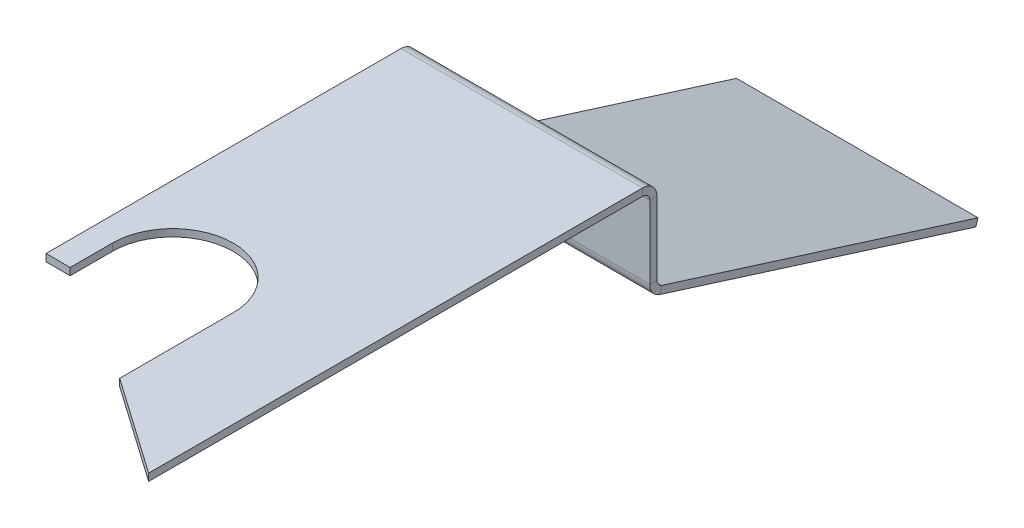
ISO-10303-21;
HEADER;
FILE_DESCRIPTION(('STEP AP214'),'2;1');
FILE_NAME('part.step','',(''),(''),'','','');
FILE_SCHEMA(('AUTOMOTIVE_DESIGN { 1 0 10303 214 1 1 1 1 }'));
ENDSEC;
DATA;
#1=APPLICATION_CONTEXT('core data for automotive mechanical design processes');
#2=APPLICATION_PROTOCOL_DEFINITION('international standard','automotive_design',2000,#1);
#3=PRODUCT_CONTEXT('',#1,'mechanical');
#4=PRODUCT('Part','Part','',(#3));
#5=PRODUCT_RELATED_PRODUCT_CATEGORY('part','',(#4));
#6=PRODUCT_DEFINITION_FORMATION('','',#4);
#7=PRODUCT_DEFINITION_CONTEXT('part definition',#1,'design');
#8=PRODUCT_DEFINITION('design','',#6,#7);
#9=PRODUCT_DEFINITION_SHAPE('','',#8);
#10=(LENGTH_UNIT() NAMED_UNIT(*) SI_UNIT(.MILLI.,.METRE.));
#11=(NAMED_UNIT(*) PLANE_ANGLE_UNIT() SI_UNIT($,.RADIAN.));
#12=(NAMED_UNIT(*) SI_UNIT($,.STERADIAN.) SOLID_ANGLE_UNIT());
#13=UNCERTAINTY_MEASURE_WITH_UNIT(LENGTH_MEASURE(1.E-05),#10,'distance_accuracy_value','');
#14=(GEOMETRIC_REPRESENTATION_CONTEXT(3) GLOBAL_UNCERTAINTY_ASSIGNED_CONTEXT((#13)) GLOBAL_UNIT_ASSIGNED_CONTEXT((#10,
#11,#12)) REPRESENTATION_CONTEXT('',''));
#15=CARTESIAN_POINT('',(0.,0.,0.));
#16=DIRECTION('',(0.,0.,1.));
#17=DIRECTION('',(1.,0.,0.));
#18=AXIS2_PLACEMENT_3D('',#15,#16,#17);
#19=CARTESIAN_POINT('',(100.,6.00000000000003,0.));
#20=DIRECTION('',(0.,1.,0.));
#21=DIRECTION('',(0.,0.,1.));
#22=AXIS2_PLACEMENT_3D('',#19,#20,#21);
#23=PLANE('',#22);
#24=DIRECTION('',(0.,0.,-1.));
#25=VECTOR('',#24,1.);
#26=CARTESIAN_POINT('',(-100.,6.00000000000001,0.));
#27=LINE('',#26,#25);
#28=CARTESIAN_POINT('',(-100.,6.00000000000001,300.));
#29=VERTEX_POINT('',#28);
#30=CARTESIAN_POINT('',(-100.,6.00000000000001,6.00000000000001));
#31=VERTEX_POINT('',#30);
#32=EDGE_CURVE('E191',#29,#31,#27,.T.);
#33=ORIENTED_EDGE('',*,*,#32,.F.);
#34=DIRECTION('',(1.,0.,0.));
#35=VECTOR('',#34,1.);
#36=CARTESIAN_POINT('',(100.,6.00000000000003,300.));
#37=LINE('',#36,#35);
#38=CARTESIAN_POINT('',(-80.,6.00000000000001,300.));
#39=VERTEX_POINT('',#38);
#40=EDGE_CURVE('E53',#39,#29,#37,.F.);
#41=ORIENTED_EDGE('',*,*,#40,.F.);
#42=DIRECTION('',(0.,0.,1.));
#43=VECTOR('',#42,1.);
#44=CARTESIAN_POINT('',(-80.,6.00000000000001,0.));
#45=LINE('',#44,#43);
#46=CARTESIAN_POINT('',(-80.,6.00000000000001,265.));
#47=VERTEX_POINT('',#46);
#48=EDGE_CURVE('E324',#47,#39,#45,.T.);
#49=ORIENTED_EDGE('',*,*,#48,.F.);
#50=CARTESIAN_POINT('',(-30.,6.00000000000001,265.));
#51=DIRECTION('',(0.,1.,0.));
#52=DIRECTION('',(0.,0.,1.));
#53=AXIS2_PLACEMENT_3D('',#50,#51,#52);
#54=CIRCLE('',#53,50.);
#55=CARTESIAN_POINT('',(20.,6.00000000000001,265.));
#56=VERTEX_POINT('',#55);
#57=EDGE_CURVE('E322',#56,#47,#54,.T.);
#58=ORIENTED_EDGE('',*,*,#57,.F.);
#59=DIRECTION('',(0.,0.,1.));
#60=VECTOR('',#59,1.);
#61=CARTESIAN_POINT('',(20.,6.00000000000001,0.));
#62=LINE('',#61,#60);
#63=CARTESIAN_POINT('',(20.,6.00000000000001,358.983396943223));
#64=VERTEX_POINT('',#63);
#65=EDGE_CURVE('E317',#64,#56,#62,.F.);
#66=ORIENTED_EDGE('',*,*,#65,.F.);
#67=DIRECTION('',(-0.819152044288993,0.,-0.573576436351044));
#68=VECTOR('',#67,1.);
#69=CARTESIAN_POINT('',(-94.9862188130756,6.00000000000001,278.469179740077));
#70=LINE('',#69,#68);
#71=CARTESIAN_POINT('',(100.,6.00000000000003,415.));
#72=VERTEX_POINT('',#71);
#73=EDGE_CURVE('E311',#72,#64,#70,.T.);
#74=ORIENTED_EDGE('',*,*,#73,.F.);
#75=DIRECTION('',(0.,0.,-1.));
#76=VECTOR('',#75,1.);
#77=CARTESIAN_POINT('',(100.,6.00000000000003,0.));
#78=LINE('',#77,#76);
#79=CARTESIAN_POINT('',(100.,6.00000000000003,6.00000000000001));
#80=VERTEX_POINT('',#79);
#81=EDGE_CURVE('E251',#72,#80,#78,.T.);
#82=ORIENTED_EDGE('',*,*,#81,.T.);
#83=DIRECTION('',(-1.,0.,0.));
#84=VECTOR('',#83,1.);
#85=CARTESIAN_POINT('',(100.,6.00000000000003,6.00000000000001));
#86=LINE('',#85,#84);
#87=EDGE_CURVE('E204',#80,#31,#86,.T.);
#88=ORIENTED_EDGE('',*,*,#87,.T.);
#89=EDGE_LOOP('',(#33,#41,#49,#58,#66,#74,#82,#88));
#90=FACE_BOUND('',#89,.T.);
#91=ADVANCED_FACE('F38',(#90),#23,.T.);
#92=CARTESIAN_POINT('',(100.,0.,0.));
#93=DIRECTION('',(0.,1.,0.));
#94=DIRECTION('',(0.,0.,1.));
#95=AXIS2_PLACEMENT_3D('',#92,#93,#94);
#96=PLANE('',#95);
#97=DIRECTION('',(-1.,0.,0.));
#98=VECTOR('',#97,1.);
#99=CARTESIAN_POINT('',(100.,0.,300.));
#100=LINE('',#99,#98);
#101=CARTESIAN_POINT('',(-80.,0.,300.));
#102=VERTEX_POINT('',#101);
#103=CARTESIAN_POINT('',(-100.,0.,300.));
#104=VERTEX_POINT('',#103);
#105=EDGE_CURVE('E273',#102,#104,#100,.T.);
#106=ORIENTED_EDGE('',*,*,#105,.T.);
#107=DIRECTION('',(0.,0.,-1.));
#108=VECTOR('',#107,1.);
#109=CARTESIAN_POINT('',(-100.,0.,0.));
#110=LINE('',#109,#108);
#111=CARTESIAN_POINT('',(-100.,0.,6.00000000000001));
#112=VERTEX_POINT('',#111);
#113=EDGE_CURVE('E193',#104,#112,#110,.T.);
#114=ORIENTED_EDGE('',*,*,#113,.T.);
#115=DIRECTION('',(-1.,0.,0.));
#116=VECTOR('',#115,1.);
#117=CARTESIAN_POINT('',(100.,0.,6.00000000000001));
#118=LINE('',#117,#116);
#119=CARTESIAN_POINT('',(100.,0.,6.00000000000001));
#120=VERTEX_POINT('',#119);
#121=EDGE_CURVE('E161',#120,#112,#118,.T.);
#122=ORIENTED_EDGE('',*,*,#121,.F.);
#123=DIRECTION('',(0.,0.,-1.));
#124=VECTOR('',#123,1.);
#125=CARTESIAN_POINT('',(100.,0.,0.));
#126=LINE('',#125,#124);
#127=CARTESIAN_POINT('',(100.,0.,415.));
#128=VERTEX_POINT('',#127);
#129=EDGE_CURVE('E150',#128,#120,#126,.T.);
#130=ORIENTED_EDGE('',*,*,#129,.F.);
#131=DIRECTION('',(-0.819152044288993,0.,-0.573576436351044));
#132=VECTOR('',#131,1.);
#133=CARTESIAN_POINT('',(-94.9862188130756,0.,278.469179740077));
#134=LINE('',#133,#132);
#135=CARTESIAN_POINT('',(20.,0.,358.983396943223));
#136=VERTEX_POINT('',#135);
#137=EDGE_CURVE('E329',#128,#136,#134,.T.);
#138=ORIENTED_EDGE('',*,*,#137,.T.);
#139=DIRECTION('',(0.,0.,-1.));
#140=VECTOR('',#139,1.);
#141=CARTESIAN_POINT('',(20.,0.,0.));
#142=LINE('',#141,#140);
#143=CARTESIAN_POINT('',(20.,0.,265.));
#144=VERTEX_POINT('',#143);
#145=EDGE_CURVE('E297',#136,#144,#142,.T.);
#146=ORIENTED_EDGE('',*,*,#145,.T.);
#147=CARTESIAN_POINT('',(-30.,0.,265.));
#148=DIRECTION('',(0.,1.,0.));
#149=DIRECTION('',(0.,0.,1.));
#150=AXIS2_PLACEMENT_3D('',#147,#148,#149);
#151=CIRCLE('',#150,50.);
#152=CARTESIAN_POINT('',(-80.,0.,265.));
#153=VERTEX_POINT('',#152);
#154=EDGE_CURVE('E290',#144,#153,#151,.T.);
#155=ORIENTED_EDGE('',*,*,#154,.T.);
#156=DIRECTION('',(0.,0.,1.));
#157=VECTOR('',#156,1.);
#158=CARTESIAN_POINT('',(-80.0000000000001,0.,0.));
#159=LINE('',#158,#157);
#160=EDGE_CURVE('E332',#153,#102,#159,.T.);
#161=ORIENTED_EDGE('',*,*,#160,.T.);
#162=EDGE_LOOP('',(#106,#114,#122,#130,#138,#146,#155,#161));
#163=FACE_BOUND('',#162,.T.);
#164=ADVANCED_FACE('F269',(#163),#96,.F.);
#165=CARTESIAN_POINT('',(-100.,-66.1971734624727,-12.));
#166=DIRECTION('',(1.,0.,0.));
#167=DIRECTION('',(0.,0.,-1.));
#168=AXIS2_PLACEMENT_3D('',#165,#166,#167);
#169=PLANE('',#168);
#170=DIRECTION('',(0.,-1.,0.));
#171=VECTOR('',#170,1.);
#172=CARTESIAN_POINT('',(-100.,0.,300.));
#173=LINE('',#172,#171);
#174=EDGE_CURVE('E177',#104,#29,#173,.F.);
#175=ORIENTED_EDGE('',*,*,#174,.T.);
#176=ORIENTED_EDGE('',*,*,#32,.T.);
#177=DIRECTION('',(0.,-1.,0.));
#178=VECTOR('',#177,1.);
#179=CARTESIAN_POINT('',(-100.,6.00000000000001,6.00000000000001));
#180=LINE('',#179,#178);
#181=EDGE_CURVE('E226',#31,#112,#180,.T.);
#182=ORIENTED_EDGE('',*,*,#181,.T.);
#183=ORIENTED_EDGE('',*,*,#113,.F.);
#184=EDGE_LOOP('',(#175,#176,#182,#183));
#185=FACE_BOUND('',#184,.T.);
#186=ADVANCED_FACE('F274',(#185),#169,.F.);
#187=CARTESIAN_POINT('',(100.,0.,6.00000000000001));
#188=DIRECTION('',(1.,0.,0.));
#189=DIRECTION('',(0.,0.,-1.));
#190=AXIS2_PLACEMENT_3D('',#187,#188,#189);
#191=PLANE('',#190);
#192=DIRECTION('',(0.,1.,0.));
#193=VECTOR('',#192,1.);
#194=CARTESIAN_POINT('',(100.,0.,6.00000000000001));
#195=LINE('',#194,#193);
#196=EDGE_CURVE('E11',#120,#80,#195,.T.);
#197=ORIENTED_EDGE('',*,*,#196,.F.);
#198=CARTESIAN_POINT('',(100.,-5.99999999999998,6.00000000000001));
#199=DIRECTION('',(1.,0.,0.));
#200=DIRECTION('',(0.,0.,-1.));
#201=AXIS2_PLACEMENT_3D('',#198,#199,#200);
#202=CIRCLE('',#201,6.);
#203=CARTESIAN_POINT('',(100.,-5.99999999999998,0.));
#204=VERTEX_POINT('',#203);
#205=EDGE_CURVE('E145',#120,#204,#202,.F.);
#206=ORIENTED_EDGE('',*,*,#205,.T.);
#207=DIRECTION('',(0.,0.,1.));
#208=VECTOR('',#207,1.);
#209=CARTESIAN_POINT('',(100.,-5.99999999999998,-6.00000000000001));
#210=LINE('',#209,#208);
#211=CARTESIAN_POINT('',(100.,-5.99999999999998,-6.00000000000001));
#212=VERTEX_POINT('',#211);
#213=EDGE_CURVE('E46',#212,#204,#210,.T.);
#214=ORIENTED_EDGE('',*,*,#213,.F.);
#215=CARTESIAN_POINT('',(100.,-5.99999999999998,6.00000000000001));
#216=DIRECTION('',(1.,0.,0.));
#217=DIRECTION('',(0.,0.,-1.));
#218=AXIS2_PLACEMENT_3D('',#215,#216,#217);
#219=CIRCLE('',#218,12.);
#220=EDGE_CURVE('E237',#80,#212,#219,.F.);
#221=ORIENTED_EDGE('',*,*,#220,.F.);
#222=EDGE_LOOP('',(#197,#206,#214,#221));
#223=FACE_BOUND('',#222,.T.);
#224=ADVANCED_FACE('F40',(#223),#191,.T.);
#225=CARTESIAN_POINT('',(100.,-5.99999999999998,-6.00000000000001));
#226=DIRECTION('',(1.,0.,0.));
#227=DIRECTION('',(0.,0.,-1.));
#228=AXIS2_PLACEMENT_3D('',#225,#226,#227);
#229=PLANE('',#228);
#230=ORIENTED_EDGE('',*,*,#129,.T.);
#231=ORIENTED_EDGE('',*,*,#196,.T.);
#232=ORIENTED_EDGE('',*,*,#81,.F.);
#233=DIRECTION('',(0.,1.,0.));
#234=VECTOR('',#233,1.);
#235=CARTESIAN_POINT('',(100.,0.,415.));
#236=LINE('',#235,#234);
#237=EDGE_CURVE('E253',#128,#72,#236,.T.);
#238=ORIENTED_EDGE('',*,*,#237,.F.);
#239=EDGE_LOOP('',(#230,#231,#232,#238));
#240=FACE_BOUND('',#239,.T.);
#241=ADVANCED_FACE('F264',(#240),#229,.T.);
#242=CARTESIAN_POINT('',(-100.,-6.00000000000001,0.));
#243=DIRECTION('',(-1.,0.,0.));
#244=DIRECTION('',(0.,0.,1.));
#245=AXIS2_PLACEMENT_3D('',#242,#243,#244);
#246=PLANE('',#245);
#247=DIRECTION('',(0.,0.,-1.));
#248=VECTOR('',#247,1.);
#249=CARTESIAN_POINT('',(-100.,-6.00000000000001,0.));
#250=LINE('',#249,#248);
#251=CARTESIAN_POINT('',(-100.,-6.00000000000001,0.));
#252=VERTEX_POINT('',#251);
#253=CARTESIAN_POINT('',(-100.,-6.00000000000001,-6.00000000000001));
#254=VERTEX_POINT('',#253);
#255=EDGE_CURVE('E143',#252,#254,#250,.T.);
#256=ORIENTED_EDGE('',*,*,#255,.F.);
#257=CARTESIAN_POINT('',(-100.,-6.00000000000001,6.00000000000001));
#258=DIRECTION('',(1.,0.,0.));
#259=DIRECTION('',(0.,0.,-1.));
#260=AXIS2_PLACEMENT_3D('',#257,#258,#259);
#261=CIRCLE('',#260,6.);
#262=EDGE_CURVE('E157',#112,#252,#261,.F.);
#263=ORIENTED_EDGE('',*,*,#262,.F.);
#264=ORIENTED_EDGE('',*,*,#181,.F.);
#265=CARTESIAN_POINT('',(-100.,-6.00000000000001,6.00000000000001));
#266=DIRECTION('',(1.,0.,0.));
#267=DIRECTION('',(0.,0.,-1.));
#268=AXIS2_PLACEMENT_3D('',#265,#266,#267);
#269=CIRCLE('',#268,12.);
#270=EDGE_CURVE('E188',#31,#254,#269,.F.);
#271=ORIENTED_EDGE('',*,*,#270,.T.);
#272=EDGE_LOOP('',(#256,#263,#264,#271));
#273=FACE_BOUND('',#272,.T.);
#274=ADVANCED_FACE('F243',(#273),#246,.T.);
#275=CARTESIAN_POINT('',(-100.,6.00000000000001,6.00000000000001));
#276=DIRECTION('',(-1.,0.,0.));
#277=DIRECTION('',(0.,0.,1.));
#278=AXIS2_PLACEMENT_3D('',#275,#276,#277);
#279=PLANE('',#278);
#280=DIRECTION('',(0.,-1.,0.));
#281=VECTOR('',#280,1.);
#282=CARTESIAN_POINT('',(-100.,0.,0.));
#283=LINE('',#282,#281);
#284=CARTESIAN_POINT('',(-100.,-66.1971734624727,0.));
#285=VERTEX_POINT('',#284);
#286=EDGE_CURVE('E196',#252,#285,#283,.T.);
#287=ORIENTED_EDGE('',*,*,#286,.F.);
#288=ORIENTED_EDGE('',*,*,#255,.T.);
#289=DIRECTION('',(0.,-1.,0.));
#290=VECTOR('',#289,1.);
#291=CARTESIAN_POINT('',(-100.,0.,-6.00000000000001));
#292=LINE('',#291,#290);
#293=CARTESIAN_POINT('',(-100.,-66.1971734624727,-6.00000000000001));
#294=VERTEX_POINT('',#293);
#295=EDGE_CURVE('E185',#254,#294,#292,.T.);
#296=ORIENTED_EDGE('',*,*,#295,.T.);
#297=DIRECTION('',(0.,0.,1.));
#298=VECTOR('',#297,1.);
#299=CARTESIAN_POINT('',(-100.,-66.1971734624727,-6.00000000000001));
#300=LINE('',#299,#298);
#301=EDGE_CURVE('E220',#294,#285,#300,.T.);
#302=ORIENTED_EDGE('',*,*,#301,.T.);
#303=EDGE_LOOP('',(#287,#288,#296,#302));
#304=FACE_BOUND('',#303,.T.);
#305=ADVANCED_FACE('F230',(#304),#279,.T.);
#306=CARTESIAN_POINT('',(100.,-66.1971734624727,0.));
#307=DIRECTION('',(1.,0.,0.));
#308=DIRECTION('',(0.,0.,-1.));
#309=AXIS2_PLACEMENT_3D('',#306,#307,#308);
#310=PLANE('',#309);
#311=DIRECTION('',(0.,0.,-1.));
#312=VECTOR('',#311,1.);
#313=CARTESIAN_POINT('',(100.,-66.1971734624727,0.));
#314=LINE('',#313,#312);
#315=CARTESIAN_POINT('',(100.,-66.1971734624727,0.));
#316=VERTEX_POINT('',#315);
#317=CARTESIAN_POINT('',(100.,-66.1971734624727,-6.00000000000001));
#318=VERTEX_POINT('',#317);
#319=EDGE_CURVE('E224',#316,#318,#314,.T.);
#320=ORIENTED_EDGE('',*,*,#319,.F.);
#321=CARTESIAN_POINT('',(100.,-66.1971734624727,-12.));
#322=DIRECTION('',(-1.,0.,0.));
#323=DIRECTION('',(0.,0.,1.));
#324=AXIS2_PLACEMENT_3D('',#321,#322,#323);
#325=CIRCLE('',#324,12.);
#326=CARTESIAN_POINT('',(100.,-77.6433644713431,-8.39656949720746));
#327=VERTEX_POINT('',#326);
#328=EDGE_CURVE('E167',#316,#327,#325,.F.);
#329=ORIENTED_EDGE('',*,*,#328,.T.);
#330=DIRECTION('',(0.,-0.953849250739196,0.300285875232711));
#331=VECTOR('',#330,1.);
#332=CARTESIAN_POINT('',(100.,-71.9202689669079,-10.1982847486037));
#333=LINE('',#332,#331);
#334=CARTESIAN_POINT('',(100.,-71.9202689669079,-10.1982847486037));
#335=VERTEX_POINT('',#334);
#336=EDGE_CURVE('E62',#335,#327,#333,.T.);
#337=ORIENTED_EDGE('',*,*,#336,.F.);
#338=CARTESIAN_POINT('',(100.,-66.1971734624727,-12.));
#339=DIRECTION('',(1.,0.,0.));
#340=DIRECTION('',(0.,0.,-1.));
#341=AXIS2_PLACEMENT_3D('',#338,#339,#340);
#342=CIRCLE('',#341,6.);
#343=EDGE_CURVE('E255',#318,#335,#342,.T.);
#344=ORIENTED_EDGE('',*,*,#343,.F.);
#345=EDGE_LOOP('',(#320,#329,#337,#344));
#346=FACE_BOUND('',#345,.T.);
#347=ADVANCED_FACE('F356',(#346),#310,.T.);
#348=CARTESIAN_POINT('',(100.,-71.9202689669079,-10.1982847486037));
#349=DIRECTION('',(1.,0.,0.));
#350=DIRECTION('',(0.,0.,-1.));
#351=AXIS2_PLACEMENT_3D('',#348,#349,#350);
#352=PLANE('',#351);
#353=DIRECTION('',(0.,-1.,0.));
#354=VECTOR('',#353,1.);
#355=CARTESIAN_POINT('',(100.,0.,0.));
#356=LINE('',#355,#354);
#357=EDGE_CURVE('E135',#204,#316,#356,.T.);
#358=ORIENTED_EDGE('',*,*,#357,.T.);
#359=ORIENTED_EDGE('',*,*,#319,.T.);
#360=DIRECTION('',(0.,-1.,0.));
#361=VECTOR('',#360,1.);
#362=CARTESIAN_POINT('',(100.,0.,-6.00000000000001));
#363=LINE('',#362,#361);
#364=EDGE_CURVE('E138',#212,#318,#363,.T.);
#365=ORIENTED_EDGE('',*,*,#364,.F.);
#366=ORIENTED_EDGE('',*,*,#213,.T.);
#367=EDGE_LOOP('',(#358,#359,#365,#366));
#368=FACE_BOUND('',#367,.T.);
#369=ADVANCED_FACE('F133',(#368),#352,.T.);
#370=CARTESIAN_POINT('',(-100.,-77.6433644713431,-8.39656949720746));
#371=DIRECTION('',(-1.,0.,0.));
#372=DIRECTION('',(0.,0.,1.));
#373=AXIS2_PLACEMENT_3D('',#370,#371,#372);
#374=PLANE('',#373);
#375=DIRECTION('',(0.,0.953849250739196,-0.300285875232711));
#376=VECTOR('',#375,1.);
#377=CARTESIAN_POINT('',(-100.,-77.6433644713431,-8.39656949720746));
#378=LINE('',#377,#376);
#379=CARTESIAN_POINT('',(-100.,-77.6433644713431,-8.39656949720746));
#380=VERTEX_POINT('',#379);
#381=CARTESIAN_POINT('',(-100.,-71.9202689669079,-10.1982847486037));
#382=VERTEX_POINT('',#381);
#383=EDGE_CURVE('E102',#380,#382,#378,.T.);
#384=ORIENTED_EDGE('',*,*,#383,.F.);
#385=CARTESIAN_POINT('',(-100.,-66.1971734624727,-12.));
#386=DIRECTION('',(-1.,0.,0.));
#387=DIRECTION('',(0.,0.,1.));
#388=AXIS2_PLACEMENT_3D('',#385,#386,#387);
#389=CIRCLE('',#388,12.);
#390=EDGE_CURVE('E198',#285,#380,#389,.F.);
#391=ORIENTED_EDGE('',*,*,#390,.F.);
#392=ORIENTED_EDGE('',*,*,#301,.F.);
#393=CARTESIAN_POINT('',(-100.,-66.1971734624727,-12.));
#394=DIRECTION('',(1.,0.,0.));
#395=DIRECTION('',(0.,0.,-1.));
#396=AXIS2_PLACEMENT_3D('',#393,#394,#395);
#397=CIRCLE('',#396,6.);
#398=EDGE_CURVE('E183',#294,#382,#397,.T.);
#399=ORIENTED_EDGE('',*,*,#398,.T.);
#400=EDGE_LOOP('',(#384,#391,#392,#399));
#401=FACE_BOUND('',#400,.T.);
#402=ADVANCED_FACE('F371',(#401),#374,.T.);
#403=CARTESIAN_POINT('',(-100.,-66.1971734624727,-6.00000000000001));
#404=DIRECTION('',(-1.,0.,0.));
#405=DIRECTION('',(0.,0.,1.));
#406=AXIS2_PLACEMENT_3D('',#403,#404,#405);
#407=PLANE('',#406);
#408=DIRECTION('',(0.,-0.30028587523271,-0.953849250739196));
#409=VECTOR('',#408,1.);
#410=CARTESIAN_POINT('',(-100.,-75.,0.));
#411=LINE('',#410,#409);
#412=CARTESIAN_POINT('',(-100.,-160.,-270.));
#413=VERTEX_POINT('',#412);
#414=EDGE_CURVE('E173',#380,#413,#411,.T.);
#415=ORIENTED_EDGE('',*,*,#414,.F.);
#416=ORIENTED_EDGE('',*,*,#383,.T.);
#417=DIRECTION('',(0.,-0.30028587523271,-0.953849250739196));
#418=VECTOR('',#417,1.);
#419=CARTESIAN_POINT('',(-100.,-69.2769044955648,-1.80171525139627));
#420=LINE('',#419,#418);
#421=CARTESIAN_POINT('',(-100.,-154.276904495565,-271.801715251396));
#422=VERTEX_POINT('',#421);
#423=EDGE_CURVE('E180',#382,#422,#420,.T.);
#424=ORIENTED_EDGE('',*,*,#423,.T.);
#425=DIRECTION('',(0.,-0.953849250739192,0.300285875232722));
#426=VECTOR('',#425,1.);
#427=CARTESIAN_POINT('',(-100.,-154.276904495565,-271.801715251396));
#428=LINE('',#427,#426);
#429=EDGE_CURVE('E176',#422,#413,#428,.T.);
#430=ORIENTED_EDGE('',*,*,#429,.T.);
#431=EDGE_LOOP('',(#415,#416,#424,#430));
#432=FACE_BOUND('',#431,.T.);
#433=ADVANCED_FACE('F366',(#432),#407,.T.);
#434=CARTESIAN_POINT('',(100.,-75.,0.));
#435=DIRECTION('',(0.,0.953849250739196,-0.30028587523271));
#436=DIRECTION('',(0.,0.30028587523271,0.953849250739196));
#437=AXIS2_PLACEMENT_3D('',#434,#435,#436);
#438=PLANE('',#437);
#439=ORIENTED_EDGE('',*,*,#414,.T.);
#440=DIRECTION('',(-1.,0.,0.));
#441=VECTOR('',#440,1.);
#442=CARTESIAN_POINT('',(100.,-160.,-270.));
#443=LINE('',#442,#441);
#444=CARTESIAN_POINT('',(100.,-160.,-270.));
#445=VERTEX_POINT('',#444);
#446=EDGE_CURVE('E218',#445,#413,#443,.T.);
#447=ORIENTED_EDGE('',*,*,#446,.F.);
#448=DIRECTION('',(0.,-0.30028587523271,-0.953849250739196));
#449=VECTOR('',#448,1.);
#450=CARTESIAN_POINT('',(100.,-75.,0.));
#451=LINE('',#450,#449);
#452=EDGE_CURVE('E108',#327,#445,#451,.T.);
#453=ORIENTED_EDGE('',*,*,#452,.F.);
#454=DIRECTION('',(-1.,0.,0.));
#455=VECTOR('',#454,1.);
#456=CARTESIAN_POINT('',(100.,-77.6433644713431,-8.39656949720746));
#457=LINE('',#456,#455);
#458=EDGE_CURVE('E169',#327,#380,#457,.T.);
#459=ORIENTED_EDGE('',*,*,#458,.T.);
#460=EDGE_LOOP('',(#439,#447,#453,#459));
#461=FACE_BOUND('',#460,.T.);
#462=ADVANCED_FACE('F368',(#461),#438,.F.);
#463=CARTESIAN_POINT('',(100.,-154.276904495565,-271.801715251396));
#464=DIRECTION('',(0.,-0.300285875232722,-0.953849250739192));
#465=DIRECTION('',(0.,0.953849250739192,-0.300285875232722));
#466=AXIS2_PLACEMENT_3D('',#463,#464,#465);
#467=PLANE('',#466);
#468=ORIENTED_EDGE('',*,*,#429,.F.);
#469=DIRECTION('',(-1.,0.,0.));
#470=VECTOR('',#469,1.);
#471=CARTESIAN_POINT('',(100.,-154.276904495565,-271.801715251396));
#472=LINE('',#471,#470);
#473=CARTESIAN_POINT('',(100.,-154.276904495565,-271.801715251396));
#474=VERTEX_POINT('',#473);
#475=EDGE_CURVE('E216',#474,#422,#472,.T.);
#476=ORIENTED_EDGE('',*,*,#475,.F.);
#477=DIRECTION('',(0.,-0.953849250739192,0.300285875232722));
#478=VECTOR('',#477,1.);
#479=CARTESIAN_POINT('',(100.,-154.276904495565,-271.801715251396));
#480=LINE('',#479,#478);
#481=EDGE_CURVE('E344',#474,#445,#480,.T.);
#482=ORIENTED_EDGE('',*,*,#481,.T.);
#483=ORIENTED_EDGE('',*,*,#446,.T.);
#484=EDGE_LOOP('',(#468,#476,#482,#483));
#485=FACE_BOUND('',#484,.T.);
#486=ADVANCED_FACE('F363',(#485),#467,.T.);
#487=CARTESIAN_POINT('',(100.,-69.2769044955648,-1.80171525139627));
#488=DIRECTION('',(0.,0.953849250739196,-0.30028587523271));
#489=DIRECTION('',(0.,0.30028587523271,0.953849250739196));
#490=AXIS2_PLACEMENT_3D('',#487,#488,#489);
#491=PLANE('',#490);
#492=ORIENTED_EDGE('',*,*,#423,.F.);
#493=DIRECTION('',(-1.,0.,0.));
#494=VECTOR('',#493,1.);
#495=CARTESIAN_POINT('',(100.,-71.9202689669079,-10.1982847486037));
#496=LINE('',#495,#494);
#497=EDGE_CURVE('E213',#335,#382,#496,.T.);
#498=ORIENTED_EDGE('',*,*,#497,.F.);
#499=DIRECTION('',(0.,-0.30028587523271,-0.953849250739196));
#500=VECTOR('',#499,1.);
#501=CARTESIAN_POINT('',(100.,-69.2769044955648,-1.80171525139627));
#502=LINE('',#501,#500);
#503=EDGE_CURVE('E347',#335,#474,#502,.T.);
#504=ORIENTED_EDGE('',*,*,#503,.T.);
#505=ORIENTED_EDGE('',*,*,#475,.T.);
#506=EDGE_LOOP('',(#492,#498,#504,#505));
#507=FACE_BOUND('',#506,.T.);
#508=ADVANCED_FACE('F359',(#507),#491,.T.);
#509=CARTESIAN_POINT('',(100.,-66.1971734624727,-12.));
#510=DIRECTION('',(-1.,0.,0.));
#511=DIRECTION('',(0.,0.,1.));
#512=AXIS2_PLACEMENT_3D('',#509,#510,#511);
#513=CYLINDRICAL_SURFACE('',#512,6.);
#514=ORIENTED_EDGE('',*,*,#398,.F.);
#515=DIRECTION('',(-1.,0.,0.));
#516=VECTOR('',#515,1.);
#517=CARTESIAN_POINT('',(100.,-66.1971734624727,-6.00000000000001));
#518=LINE('',#517,#516);
#519=EDGE_CURVE('E210',#318,#294,#518,.T.);
#520=ORIENTED_EDGE('',*,*,#519,.F.);
#521=ORIENTED_EDGE('',*,*,#343,.T.);
#522=ORIENTED_EDGE('',*,*,#497,.T.);
#523=EDGE_LOOP('',(#514,#520,#521,#522));
#524=FACE_BOUND('',#523,.T.);
#525=ADVANCED_FACE('F352',(#524),#513,.F.);
#526=CARTESIAN_POINT('',(100.,0.,-6.00000000000001));
#527=DIRECTION('',(0.,0.,-1.));
#528=DIRECTION('',(0.,1.,0.));
#529=AXIS2_PLACEMENT_3D('',#526,#527,#528);
#530=PLANE('',#529);
#531=ORIENTED_EDGE('',*,*,#295,.F.);
#532=DIRECTION('',(-1.,0.,0.));
#533=VECTOR('',#532,1.);
#534=CARTESIAN_POINT('',(100.,-5.99999999999998,-6.00000000000001));
#535=LINE('',#534,#533);
#536=EDGE_CURVE('E207',#212,#254,#535,.T.);
#537=ORIENTED_EDGE('',*,*,#536,.F.);
#538=ORIENTED_EDGE('',*,*,#364,.T.);
#539=ORIENTED_EDGE('',*,*,#519,.T.);
#540=EDGE_LOOP('',(#531,#537,#538,#539));
#541=FACE_BOUND('',#540,.T.);
#542=ADVANCED_FACE('F239',(#541),#530,.T.);
#543=CARTESIAN_POINT('',(100.,-5.99999999999998,6.00000000000001));
#544=DIRECTION('',(-1.,0.,0.));
#545=DIRECTION('',(0.,0.,1.));
#546=AXIS2_PLACEMENT_3D('',#543,#544,#545);
#547=CYLINDRICAL_SURFACE('',#546,12.);
#548=ORIENTED_EDGE('',*,*,#270,.F.);
#549=ORIENTED_EDGE('',*,*,#87,.F.);
#550=ORIENTED_EDGE('',*,*,#220,.T.);
#551=ORIENTED_EDGE('',*,*,#536,.T.);
#552=EDGE_LOOP('',(#548,#549,#550,#551));
#553=FACE_BOUND('',#552,.T.);
#554=ADVANCED_FACE('F235',(#553),#547,.T.);
#555=CARTESIAN_POINT('',(100.,-5.99999999999998,6.00000000000001));
#556=DIRECTION('',(-1.,0.,0.));
#557=DIRECTION('',(0.,0.,1.));
#558=AXIS2_PLACEMENT_3D('',#555,#556,#557);
#559=CYLINDRICAL_SURFACE('',#558,6.);
#560=ORIENTED_EDGE('',*,*,#262,.T.);
#561=DIRECTION('',(-1.,0.,0.));
#562=VECTOR('',#561,1.);
#563=CARTESIAN_POINT('',(100.,-5.99999999999998,0.));
#564=LINE('',#563,#562);
#565=EDGE_CURVE('E154',#204,#252,#564,.T.);
#566=ORIENTED_EDGE('',*,*,#565,.F.);
#567=ORIENTED_EDGE('',*,*,#205,.F.);
#568=ORIENTED_EDGE('',*,*,#121,.T.);
#569=EDGE_LOOP('',(#560,#566,#567,#568));
#570=FACE_BOUND('',#569,.T.);
#571=ADVANCED_FACE('F155',(#570),#559,.F.);
#572=CARTESIAN_POINT('',(100.,0.,0.));
#573=DIRECTION('',(0.,0.,-1.));
#574=DIRECTION('',(0.,1.,0.));
#575=AXIS2_PLACEMENT_3D('',#572,#573,#574);
#576=PLANE('',#575);
#577=ORIENTED_EDGE('',*,*,#286,.T.);
#578=DIRECTION('',(-1.,0.,0.));
#579=VECTOR('',#578,1.);
#580=CARTESIAN_POINT('',(100.,-66.1971734624727,0.));
#581=LINE('',#580,#579);
#582=EDGE_CURVE('E162',#316,#285,#581,.T.);
#583=ORIENTED_EDGE('',*,*,#582,.F.);
#584=ORIENTED_EDGE('',*,*,#357,.F.);
#585=ORIENTED_EDGE('',*,*,#565,.T.);
#586=EDGE_LOOP('',(#577,#583,#584,#585));
#587=FACE_BOUND('',#586,.T.);
#588=ADVANCED_FACE('F164',(#587),#576,.F.);
#589=CARTESIAN_POINT('',(100.,-66.1971734624727,-12.));
#590=DIRECTION('',(-1.,0.,0.));
#591=DIRECTION('',(0.,0.,1.));
#592=AXIS2_PLACEMENT_3D('',#589,#590,#591);
#593=CYLINDRICAL_SURFACE('',#592,12.);
#594=ORIENTED_EDGE('',*,*,#390,.T.);
#595=ORIENTED_EDGE('',*,*,#458,.F.);
#596=ORIENTED_EDGE('',*,*,#328,.F.);
#597=ORIENTED_EDGE('',*,*,#582,.T.);
#598=EDGE_LOOP('',(#594,#595,#596,#597));
#599=FACE_BOUND('',#598,.T.);
#600=ADVANCED_FACE('F370',(#599),#593,.T.);
#601=CARTESIAN_POINT('',(100.,-66.1971734624727,-12.));
#602=DIRECTION('',(1.,0.,0.));
#603=DIRECTION('',(0.,0.,-1.));
#604=AXIS2_PLACEMENT_3D('',#601,#602,#603);
#605=PLANE('',#604);
#606=ORIENTED_EDGE('',*,*,#452,.T.);
#607=ORIENTED_EDGE('',*,*,#481,.F.);
#608=ORIENTED_EDGE('',*,*,#503,.F.);
#609=ORIENTED_EDGE('',*,*,#336,.T.);
#610=EDGE_LOOP('',(#606,#607,#608,#609));
#611=FACE_BOUND('',#610,.T.);
#612=ADVANCED_FACE('F360',(#611),#605,.T.);
#613=CARTESIAN_POINT('',(100.,0.,300.));
#614=DIRECTION('',(0.,0.,-1.));
#615=DIRECTION('',(-1.,0.,0.));
#616=AXIS2_PLACEMENT_3D('',#613,#614,#615);
#617=PLANE('',#616);
#618=ORIENTED_EDGE('',*,*,#174,.F.);
#619=ORIENTED_EDGE('',*,*,#105,.F.);
#620=DIRECTION('',(0.,-1.,0.));
#621=VECTOR('',#620,1.);
#622=CARTESIAN_POINT('',(-80.,0.,300.));
#623=LINE('',#622,#621);
#624=EDGE_CURVE('E340',#102,#39,#623,.F.);
#625=ORIENTED_EDGE('',*,*,#624,.T.);
#626=ORIENTED_EDGE('',*,*,#40,.T.);
#627=EDGE_LOOP('',(#618,#619,#625,#626));
#628=FACE_BOUND('',#627,.T.);
#629=ADVANCED_FACE('F446',(#628),#617,.F.);
#630=CARTESIAN_POINT('',(-80.0000000000001,0.,0.));
#631=DIRECTION('',(-1.,0.,0.));
#632=DIRECTION('',(0.,0.,1.));
#633=AXIS2_PLACEMENT_3D('',#630,#631,#632);
#634=PLANE('',#633);
#635=ORIENTED_EDGE('',*,*,#624,.F.);
#636=ORIENTED_EDGE('',*,*,#160,.F.);
#637=DIRECTION('',(0.,-1.,0.));
#638=VECTOR('',#637,1.);
#639=CARTESIAN_POINT('',(-80.,0.,265.));
#640=LINE('',#639,#638);
#641=EDGE_CURVE('E337',#153,#47,#640,.F.);
#642=ORIENTED_EDGE('',*,*,#641,.T.);
#643=ORIENTED_EDGE('',*,*,#48,.T.);
#644=EDGE_LOOP('',(#635,#636,#642,#643));
#645=FACE_BOUND('',#644,.T.);
#646=ADVANCED_FACE('F453',(#645),#634,.F.);
#647=CARTESIAN_POINT('',(-30.,0.,265.));
#648=DIRECTION('',(0.,1.,0.));
#649=DIRECTION('',(0.,0.,1.));
#650=AXIS2_PLACEMENT_3D('',#647,#648,#649);
#651=CYLINDRICAL_SURFACE('',#650,50.);
#652=ORIENTED_EDGE('',*,*,#641,.F.);
#653=ORIENTED_EDGE('',*,*,#154,.F.);
#654=DIRECTION('',(0.,-1.,0.));
#655=VECTOR('',#654,1.);
#656=CARTESIAN_POINT('',(20.,0.,265.));
#657=LINE('',#656,#655);
#658=EDGE_CURVE('E318',#144,#56,#657,.F.);
#659=ORIENTED_EDGE('',*,*,#658,.T.);
#660=ORIENTED_EDGE('',*,*,#57,.T.);
#661=EDGE_LOOP('',(#652,#653,#659,#660));
#662=FACE_BOUND('',#661,.T.);
#663=ADVANCED_FACE('F460',(#662),#651,.F.);
#664=CARTESIAN_POINT('',(20.,0.,0.));
#665=DIRECTION('',(1.,0.,0.));
#666=DIRECTION('',(0.,0.,-1.));
#667=AXIS2_PLACEMENT_3D('',#664,#665,#666);
#668=PLANE('',#667);
#669=ORIENTED_EDGE('',*,*,#658,.F.);
#670=ORIENTED_EDGE('',*,*,#145,.F.);
#671=DIRECTION('',(0.,-1.,0.));
#672=VECTOR('',#671,1.);
#673=CARTESIAN_POINT('',(20.,0.,358.983396943223));
#674=LINE('',#673,#672);
#675=EDGE_CURVE('E313',#136,#64,#674,.F.);
#676=ORIENTED_EDGE('',*,*,#675,.T.);
#677=ORIENTED_EDGE('',*,*,#65,.T.);
#678=EDGE_LOOP('',(#669,#670,#676,#677));
#679=FACE_BOUND('',#678,.T.);
#680=ADVANCED_FACE('F316',(#679),#668,.F.);
#681=CARTESIAN_POINT('',(-94.9862188130756,0.,278.469179740077));
#682=DIRECTION('',(0.573576436351044,0.,-0.819152044288993));
#683=DIRECTION('',(-0.819152044288993,0.,-0.573576436351044));
#684=AXIS2_PLACEMENT_3D('',#681,#682,#683);
#685=PLANE('',#684);
#686=ORIENTED_EDGE('',*,*,#675,.F.);
#687=ORIENTED_EDGE('',*,*,#137,.F.);
#688=ORIENTED_EDGE('',*,*,#237,.T.);
#689=ORIENTED_EDGE('',*,*,#73,.T.);
#690=EDGE_LOOP('',(#686,#687,#688,#689));
#691=FACE_BOUND('',#690,.T.);
#692=ADVANCED_FACE('F312',(#691),#685,.F.);
#693=CLOSED_SHELL('',(#91,#164,#186,#224,#241,#274,#305,#347,#369,#402,#433,#462,#486,#508,#525,
#542,#554,#571,#588,#600,#612,#629,#646,#663,#680,#692));
#694=MANIFOLD_SOLID_BREP('B2',#693);
#695=ADVANCED_BREP_SHAPE_REPRESENTATION('',(#18,#694),#14);
#696=SHAPE_DEFINITION_REPRESENTATION(#9,#695);
ENDSEC;
END-ISO-10303-21;
